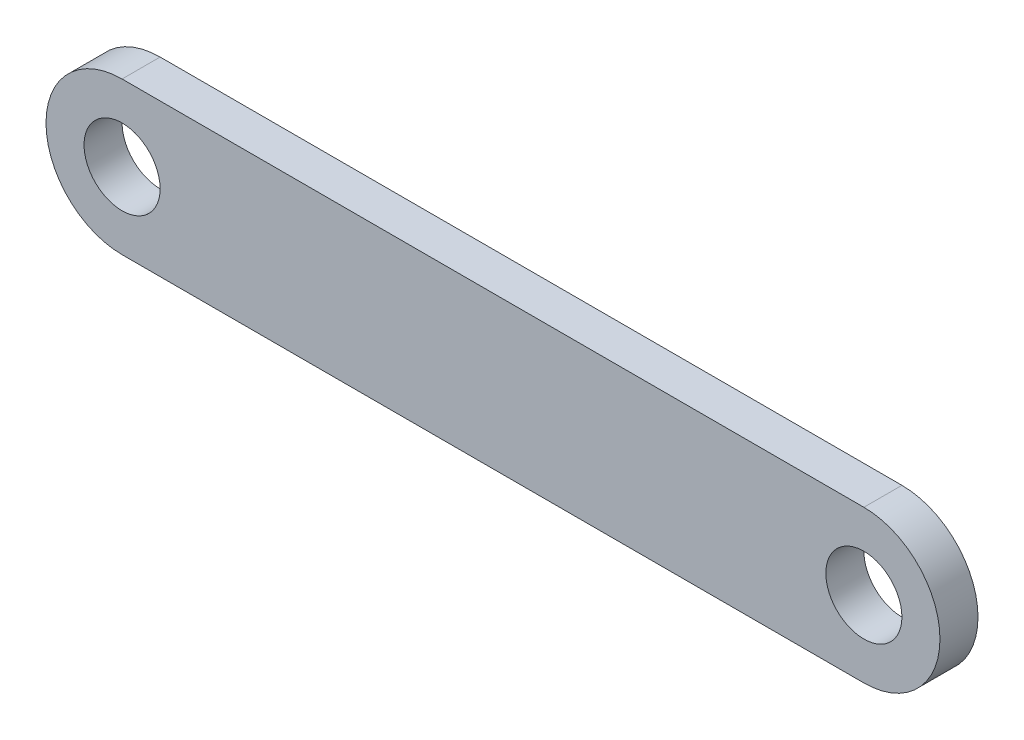
ISO-10303-21;
HEADER;
FILE_DESCRIPTION(('STEP AP214'),'2;1');
FILE_NAME('part.step','',(''),(''),'','','');
FILE_SCHEMA(('AUTOMOTIVE_DESIGN { 1 0 10303 214 1 1 1 1 }'));
ENDSEC;
DATA;
#1=APPLICATION_CONTEXT('core data for automotive mechanical design processes');
#2=APPLICATION_PROTOCOL_DEFINITION('international standard','automotive_design',2000,#1);
#3=PRODUCT_CONTEXT('',#1,'mechanical');
#4=PRODUCT('Part','Part','',(#3));
#5=PRODUCT_RELATED_PRODUCT_CATEGORY('part','',(#4));
#6=PRODUCT_DEFINITION_FORMATION('','',#4);
#7=PRODUCT_DEFINITION_CONTEXT('part definition',#1,'design');
#8=PRODUCT_DEFINITION('design','',#6,#7);
#9=PRODUCT_DEFINITION_SHAPE('','',#8);
#10=(LENGTH_UNIT() NAMED_UNIT(*) SI_UNIT(.MILLI.,.METRE.));
#11=(NAMED_UNIT(*) PLANE_ANGLE_UNIT() SI_UNIT($,.RADIAN.));
#12=(NAMED_UNIT(*) SI_UNIT($,.STERADIAN.) SOLID_ANGLE_UNIT());
#13=UNCERTAINTY_MEASURE_WITH_UNIT(LENGTH_MEASURE(1.E-05),#10,'distance_accuracy_value','');
#14=(GEOMETRIC_REPRESENTATION_CONTEXT(3) GLOBAL_UNCERTAINTY_ASSIGNED_CONTEXT((#13)) GLOBAL_UNIT_ASSIGNED_CONTEXT((#10,
#11,#12)) REPRESENTATION_CONTEXT('',''));
#15=CARTESIAN_POINT('',(0.,0.,0.));
#16=DIRECTION('',(0.,0.,1.));
#17=DIRECTION('',(1.,0.,0.));
#18=AXIS2_PLACEMENT_3D('',#15,#16,#17);
#19=CARTESIAN_POINT('',(9.75,0.,1.));
#20=DIRECTION('',(0.,0.,-1.));
#21=DIRECTION('',(-1.,0.,0.));
#22=AXIS2_PLACEMENT_3D('',#19,#20,#21);
#23=PLANE('',#22);
#24=CARTESIAN_POINT('',(9.75,0.,1.));
#25=DIRECTION('',(0.,0.,1.));
#26=DIRECTION('',(-1.,0.,0.));
#27=AXIS2_PLACEMENT_3D('',#24,#25,#26);
#28=CIRCLE('',#27,2.);
#29=CARTESIAN_POINT('',(9.75,-2.,1.));
#30=VERTEX_POINT('',#29);
#31=CARTESIAN_POINT('',(9.75,2.,1.));
#32=VERTEX_POINT('',#31);
#33=EDGE_CURVE('E96',#30,#32,#28,.T.);
#34=ORIENTED_EDGE('',*,*,#33,.T.);
#35=DIRECTION('',(-1.,0.,0.));
#36=VECTOR('',#35,1.);
#37=CARTESIAN_POINT('',(-9.75,2.,1.));
#38=LINE('',#37,#36);
#39=CARTESIAN_POINT('',(-9.75,2.,1.));
#40=VERTEX_POINT('',#39);
#41=EDGE_CURVE('E91',#32,#40,#38,.T.);
#42=ORIENTED_EDGE('',*,*,#41,.T.);
#43=CARTESIAN_POINT('',(-9.75,0.,1.));
#44=DIRECTION('',(0.,0.,1.));
#45=DIRECTION('',(1.,0.,0.));
#46=AXIS2_PLACEMENT_3D('',#43,#44,#45);
#47=CIRCLE('',#46,2.);
#48=CARTESIAN_POINT('',(-9.75,-2.,1.));
#49=VERTEX_POINT('',#48);
#50=EDGE_CURVE('E94',#40,#49,#47,.T.);
#51=ORIENTED_EDGE('',*,*,#50,.T.);
#52=DIRECTION('',(1.,0.,0.));
#53=VECTOR('',#52,1.);
#54=CARTESIAN_POINT('',(-9.75,-2.,1.));
#55=LINE('',#54,#53);
#56=EDGE_CURVE('E61',#49,#30,#55,.T.);
#57=ORIENTED_EDGE('',*,*,#56,.T.);
#58=EDGE_LOOP('',(#34,#42,#51,#57));
#59=FACE_BOUND('',#58,.T.);
#60=CARTESIAN_POINT('',(-9.75,0.,1.));
#61=DIRECTION('',(0.,0.,1.));
#62=DIRECTION('',(1.,0.,0.));
#63=AXIS2_PLACEMENT_3D('',#60,#61,#62);
#64=CIRCLE('',#63,1.);
#65=CARTESIAN_POINT('',(-8.75,0.,1.));
#66=VERTEX_POINT('',#65);
#67=EDGE_CURVE('E116',#66,#66,#64,.T.);
#68=ORIENTED_EDGE('',*,*,#67,.F.);
#69=EDGE_LOOP('',(#68));
#70=FACE_BOUND('',#69,.T.);
#71=CARTESIAN_POINT('',(9.75,0.,1.));
#72=DIRECTION('',(0.,0.,1.));
#73=DIRECTION('',(1.,0.,0.));
#74=AXIS2_PLACEMENT_3D('',#71,#72,#73);
#75=CIRCLE('',#74,1.);
#76=CARTESIAN_POINT('',(10.75,0.,1.));
#77=VERTEX_POINT('',#76);
#78=EDGE_CURVE('E138',#77,#77,#75,.T.);
#79=ORIENTED_EDGE('',*,*,#78,.F.);
#80=EDGE_LOOP('',(#79));
#81=FACE_BOUND('',#80,.T.);
#82=ADVANCED_FACE('F43',(#59,#70,#81),#23,.F.);
#83=CARTESIAN_POINT('',(9.75,0.,0.));
#84=DIRECTION('',(0.,0.,-1.));
#85=DIRECTION('',(-1.,0.,0.));
#86=AXIS2_PLACEMENT_3D('',#83,#84,#85);
#87=PLANE('',#86);
#88=CARTESIAN_POINT('',(-9.75,0.,0.));
#89=DIRECTION('',(0.,0.,1.));
#90=DIRECTION('',(1.,0.,0.));
#91=AXIS2_PLACEMENT_3D('',#88,#89,#90);
#92=CIRCLE('',#91,1.);
#93=CARTESIAN_POINT('',(-8.75,0.,0.));
#94=VERTEX_POINT('',#93);
#95=EDGE_CURVE('E134',#94,#94,#92,.T.);
#96=ORIENTED_EDGE('',*,*,#95,.T.);
#97=EDGE_LOOP('',(#96));
#98=FACE_BOUND('',#97,.T.);
#99=CARTESIAN_POINT('',(9.75,0.,0.));
#100=DIRECTION('',(0.,0.,1.));
#101=DIRECTION('',(-1.,0.,0.));
#102=AXIS2_PLACEMENT_3D('',#99,#100,#101);
#103=CIRCLE('',#102,2.);
#104=CARTESIAN_POINT('',(9.75,-2.,0.));
#105=VERTEX_POINT('',#104);
#106=CARTESIAN_POINT('',(9.75,2.,0.));
#107=VERTEX_POINT('',#106);
#108=EDGE_CURVE('E112',#105,#107,#103,.T.);
#109=ORIENTED_EDGE('',*,*,#108,.F.);
#110=DIRECTION('',(1.,0.,0.));
#111=VECTOR('',#110,1.);
#112=CARTESIAN_POINT('',(-9.75,-2.,0.));
#113=LINE('',#112,#111);
#114=CARTESIAN_POINT('',(-9.75,-2.,0.));
#115=VERTEX_POINT('',#114);
#116=EDGE_CURVE('E84',#115,#105,#113,.T.);
#117=ORIENTED_EDGE('',*,*,#116,.F.);
#118=CARTESIAN_POINT('',(-9.75,0.,0.));
#119=DIRECTION('',(0.,0.,1.));
#120=DIRECTION('',(1.,0.,0.));
#121=AXIS2_PLACEMENT_3D('',#118,#119,#120);
#122=CIRCLE('',#121,2.);
#123=CARTESIAN_POINT('',(-9.75,2.,0.));
#124=VERTEX_POINT('',#123);
#125=EDGE_CURVE('E78',#124,#115,#122,.T.);
#126=ORIENTED_EDGE('',*,*,#125,.F.);
#127=DIRECTION('',(-1.,0.,0.));
#128=VECTOR('',#127,1.);
#129=CARTESIAN_POINT('',(-9.75,2.,0.));
#130=LINE('',#129,#128);
#131=EDGE_CURVE('E101',#107,#124,#130,.T.);
#132=ORIENTED_EDGE('',*,*,#131,.F.);
#133=EDGE_LOOP('',(#109,#117,#126,#132));
#134=FACE_BOUND('',#133,.T.);
#135=CARTESIAN_POINT('',(9.75,0.,0.));
#136=DIRECTION('',(0.,0.,1.));
#137=DIRECTION('',(1.,0.,0.));
#138=AXIS2_PLACEMENT_3D('',#135,#136,#137);
#139=CIRCLE('',#138,1.);
#140=CARTESIAN_POINT('',(10.75,0.,0.));
#141=VERTEX_POINT('',#140);
#142=EDGE_CURVE('E142',#141,#141,#139,.T.);
#143=ORIENTED_EDGE('',*,*,#142,.T.);
#144=EDGE_LOOP('',(#143));
#145=FACE_BOUND('',#144,.T.);
#146=ADVANCED_FACE('F129',(#98,#134,#145),#87,.T.);
#147=CARTESIAN_POINT('',(9.75,0.,1.));
#148=DIRECTION('',(0.,0.,-1.));
#149=DIRECTION('',(-1.,0.,0.));
#150=AXIS2_PLACEMENT_3D('',#147,#148,#149);
#151=CYLINDRICAL_SURFACE('',#150,2.);
#152=ORIENTED_EDGE('',*,*,#108,.T.);
#153=DIRECTION('',(0.,0.,-1.));
#154=VECTOR('',#153,1.);
#155=CARTESIAN_POINT('',(9.75,2.,1.));
#156=LINE('',#155,#154);
#157=EDGE_CURVE('E11',#32,#107,#156,.T.);
#158=ORIENTED_EDGE('',*,*,#157,.F.);
#159=ORIENTED_EDGE('',*,*,#33,.F.);
#160=DIRECTION('',(0.,0.,-1.));
#161=VECTOR('',#160,1.);
#162=CARTESIAN_POINT('',(9.75,-2.,1.));
#163=LINE('',#162,#161);
#164=EDGE_CURVE('E108',#30,#105,#163,.T.);
#165=ORIENTED_EDGE('',*,*,#164,.T.);
#166=EDGE_LOOP('',(#152,#158,#159,#165));
#167=FACE_BOUND('',#166,.T.);
#168=ADVANCED_FACE('F45',(#167),#151,.T.);
#169=CARTESIAN_POINT('',(-9.75,2.,1.));
#170=DIRECTION('',(0.,-1.,0.));
#171=DIRECTION('',(0.,0.,-1.));
#172=AXIS2_PLACEMENT_3D('',#169,#170,#171);
#173=PLANE('',#172);
#174=ORIENTED_EDGE('',*,*,#131,.T.);
#175=DIRECTION('',(0.,0.,-1.));
#176=VECTOR('',#175,1.);
#177=CARTESIAN_POINT('',(-9.75,2.,1.));
#178=LINE('',#177,#176);
#179=EDGE_CURVE('E53',#40,#124,#178,.T.);
#180=ORIENTED_EDGE('',*,*,#179,.F.);
#181=ORIENTED_EDGE('',*,*,#41,.F.);
#182=ORIENTED_EDGE('',*,*,#157,.T.);
#183=EDGE_LOOP('',(#174,#180,#181,#182));
#184=FACE_BOUND('',#183,.T.);
#185=ADVANCED_FACE('F100',(#184),#173,.F.);
#186=CARTESIAN_POINT('',(-9.75,0.,1.));
#187=DIRECTION('',(0.,0.,-1.));
#188=DIRECTION('',(-1.,0.,0.));
#189=AXIS2_PLACEMENT_3D('',#186,#187,#188);
#190=CYLINDRICAL_SURFACE('',#189,2.);
#191=ORIENTED_EDGE('',*,*,#125,.T.);
#192=DIRECTION('',(0.,0.,-1.));
#193=VECTOR('',#192,1.);
#194=CARTESIAN_POINT('',(-9.75,-2.,1.));
#195=LINE('',#194,#193);
#196=EDGE_CURVE('E103',#49,#115,#195,.T.);
#197=ORIENTED_EDGE('',*,*,#196,.F.);
#198=ORIENTED_EDGE('',*,*,#50,.F.);
#199=ORIENTED_EDGE('',*,*,#179,.T.);
#200=EDGE_LOOP('',(#191,#197,#198,#199));
#201=FACE_BOUND('',#200,.T.);
#202=ADVANCED_FACE('F104',(#201),#190,.T.);
#203=CARTESIAN_POINT('',(-9.75,-2.,1.));
#204=DIRECTION('',(0.,1.,0.));
#205=DIRECTION('',(0.,0.,1.));
#206=AXIS2_PLACEMENT_3D('',#203,#204,#205);
#207=PLANE('',#206);
#208=ORIENTED_EDGE('',*,*,#116,.T.);
#209=ORIENTED_EDGE('',*,*,#164,.F.);
#210=ORIENTED_EDGE('',*,*,#56,.F.);
#211=ORIENTED_EDGE('',*,*,#196,.T.);
#212=EDGE_LOOP('',(#208,#209,#210,#211));
#213=FACE_BOUND('',#212,.T.);
#214=ADVANCED_FACE('F126',(#213),#207,.F.);
#215=CARTESIAN_POINT('',(-9.75,0.,1.));
#216=DIRECTION('',(0.,0.,-1.));
#217=DIRECTION('',(-1.,0.,0.));
#218=AXIS2_PLACEMENT_3D('',#215,#216,#217);
#219=CYLINDRICAL_SURFACE('',#218,1.);
#220=ORIENTED_EDGE('',*,*,#67,.T.);
#221=EDGE_LOOP('',(#220));
#222=FACE_BOUND('',#221,.T.);
#223=ORIENTED_EDGE('',*,*,#95,.F.);
#224=EDGE_LOOP('',(#223));
#225=FACE_BOUND('',#224,.T.);
#226=ADVANCED_FACE('F161',(#222,#225),#219,.F.);
#227=CARTESIAN_POINT('',(9.75,0.,1.));
#228=DIRECTION('',(0.,0.,-1.));
#229=DIRECTION('',(-1.,0.,0.));
#230=AXIS2_PLACEMENT_3D('',#227,#228,#229);
#231=CYLINDRICAL_SURFACE('',#230,1.);
#232=ORIENTED_EDGE('',*,*,#78,.T.);
#233=EDGE_LOOP('',(#232));
#234=FACE_BOUND('',#233,.T.);
#235=ORIENTED_EDGE('',*,*,#142,.F.);
#236=EDGE_LOOP('',(#235));
#237=FACE_BOUND('',#236,.T.);
#238=ADVANCED_FACE('F150',(#234,#237),#231,.F.);
#239=CLOSED_SHELL('',(#82,#146,#168,#185,#202,#214,#226,#238));
#240=MANIFOLD_SOLID_BREP('B2',#239);
#241=ADVANCED_BREP_SHAPE_REPRESENTATION('',(#18,#240),#14);
#242=SHAPE_DEFINITION_REPRESENTATION(#9,#241);
ENDSEC;
END-ISO-10303-21;
